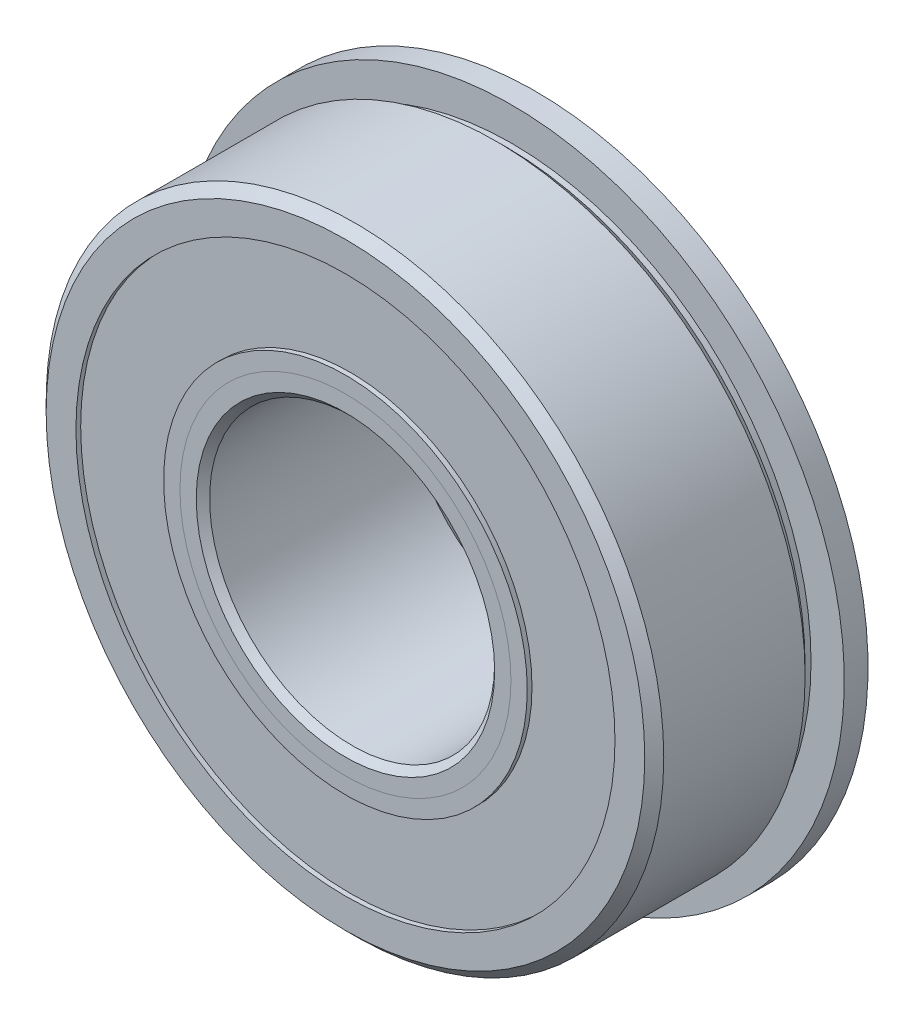
ISO-10303-21;
HEADER;
FILE_DESCRIPTION(('STEP AP214'),'2;1');
FILE_NAME('part.step','',(''),(''),'','','');
FILE_SCHEMA(('AUTOMOTIVE_DESIGN { 1 0 10303 214 1 1 1 1 }'));
ENDSEC;
DATA;
#1=APPLICATION_CONTEXT('core data for automotive mechanical design processes');
#2=APPLICATION_PROTOCOL_DEFINITION('international standard','automotive_design',2000,#1);
#3=PRODUCT_CONTEXT('',#1,'mechanical');
#4=PRODUCT('Part','Part','',(#3));
#5=PRODUCT_RELATED_PRODUCT_CATEGORY('part','',(#4));
#6=PRODUCT_DEFINITION_FORMATION('','',#4);
#7=PRODUCT_DEFINITION_CONTEXT('part definition',#1,'design');
#8=PRODUCT_DEFINITION('design','',#6,#7);
#9=PRODUCT_DEFINITION_SHAPE('','',#8);
#10=(LENGTH_UNIT() NAMED_UNIT(*) SI_UNIT(.MILLI.,.METRE.));
#11=(NAMED_UNIT(*) PLANE_ANGLE_UNIT() SI_UNIT($,.RADIAN.));
#12=(NAMED_UNIT(*) SI_UNIT($,.STERADIAN.) SOLID_ANGLE_UNIT());
#13=UNCERTAINTY_MEASURE_WITH_UNIT(LENGTH_MEASURE(1.E-05),#10,'distance_accuracy_value','');
#14=(GEOMETRIC_REPRESENTATION_CONTEXT(3) GLOBAL_UNCERTAINTY_ASSIGNED_CONTEXT((#13)) GLOBAL_UNIT_ASSIGNED_CONTEXT((#10,
#11,#12)) REPRESENTATION_CONTEXT('',''));
#15=CARTESIAN_POINT('',(0.,0.,0.));
#16=DIRECTION('',(0.,0.,1.));
#17=DIRECTION('',(1.,0.,0.));
#18=AXIS2_PLACEMENT_3D('',#15,#16,#17);
#19=CARTESIAN_POINT('',(0.,0.,6.35));
#20=DIRECTION('',(0.,0.,1.));
#21=DIRECTION('',(1.,0.,0.));
#22=AXIS2_PLACEMENT_3D('',#19,#20,#21);
#23=CYLINDRICAL_SURFACE('',#22,11.5062);
#24=CARTESIAN_POINT('',(0.,0.,-4.66432619959931));
#25=DIRECTION('',(0.,0.,1.));
#26=DIRECTION('',(1.,0.,0.));
#27=AXIS2_PLACEMENT_3D('',#24,#25,#26);
#28=CIRCLE('',#27,11.5062);
#29=CARTESIAN_POINT('',(11.5062,0.,-4.66432619959931));
#30=VERTEX_POINT('',#29);
#31=EDGE_CURVE('E11',#30,#30,#28,.T.);
#32=ORIENTED_EDGE('',*,*,#31,.T.);
#33=EDGE_LOOP('',(#32));
#34=FACE_BOUND('',#33,.T.);
#35=CARTESIAN_POINT('',(0.,0.,-5.7785));
#36=DIRECTION('',(0.,0.,-1.));
#37=DIRECTION('',(-1.,0.,0.));
#38=AXIS2_PLACEMENT_3D('',#35,#36,#37);
#39=CIRCLE('',#38,11.5062);
#40=CARTESIAN_POINT('',(-11.5062,0.,-5.7785));
#41=VERTEX_POINT('',#40);
#42=EDGE_CURVE('E68',#41,#41,#39,.T.);
#43=ORIENTED_EDGE('',*,*,#42,.T.);
#44=EDGE_LOOP('',(#43));
#45=FACE_BOUND('',#44,.T.);
#46=ADVANCED_FACE('F47',(#34,#45),#23,.F.);
#47=CARTESIAN_POINT('',(0.,18.0120192307692,-6.0325));
#48=DIRECTION('',(0.,0.,1.));
#49=DIRECTION('',(1.,0.,0.));
#50=AXIS2_PLACEMENT_3D('',#47,#48,#49);
#51=PLANE('',#50);
#52=CARTESIAN_POINT('',(0.,0.,-6.0325));
#53=DIRECTION('',(0.,0.,-1.));
#54=DIRECTION('',(-1.,0.,0.));
#55=AXIS2_PLACEMENT_3D('',#52,#53,#54);
#56=CIRCLE('',#55,12.426696);
#57=CARTESIAN_POINT('',(-12.426696,0.,-6.0325));
#58=VERTEX_POINT('',#57);
#59=EDGE_CURVE('E65',#58,#58,#56,.T.);
#60=ORIENTED_EDGE('',*,*,#59,.F.);
#61=EDGE_LOOP('',(#60));
#62=FACE_BOUND('',#61,.T.);
#63=CARTESIAN_POINT('',(0.,0.,-6.0325));
#64=DIRECTION('',(0.,0.,1.));
#65=DIRECTION('',(1.,0.,0.));
#66=AXIS2_PLACEMENT_3D('',#63,#64,#65);
#67=CIRCLE('',#66,18.0120192307692);
#68=CARTESIAN_POINT('',(18.0120192307692,0.,-6.0325));
#69=VERTEX_POINT('',#68);
#70=EDGE_CURVE('E58',#69,#69,#67,.T.);
#71=ORIENTED_EDGE('',*,*,#70,.F.);
#72=EDGE_LOOP('',(#71));
#73=FACE_BOUND('',#72,.T.);
#74=ADVANCED_FACE('F49',(#62,#73),#51,.F.);
#75=CARTESIAN_POINT('',(0.,18.0120192307692,-4.66432619959931));
#76=DIRECTION('',(0.,0.,-1.));
#77=DIRECTION('',(-1.,0.,0.));
#78=AXIS2_PLACEMENT_3D('',#75,#76,#77);
#79=PLANE('',#78);
#80=ORIENTED_EDGE('',*,*,#31,.F.);
#81=EDGE_LOOP('',(#80));
#82=FACE_BOUND('',#81,.T.);
#83=CARTESIAN_POINT('',(0.,0.,-4.66432619959931));
#84=DIRECTION('',(0.,0.,1.));
#85=DIRECTION('',(1.,0.,0.));
#86=AXIS2_PLACEMENT_3D('',#83,#84,#85);
#87=CIRCLE('',#86,18.0120192307692);
#88=CARTESIAN_POINT('',(18.0120192307692,0.,-4.66432619959931));
#89=VERTEX_POINT('',#88);
#90=EDGE_CURVE('E54',#89,#89,#87,.T.);
#91=ORIENTED_EDGE('',*,*,#90,.T.);
#92=EDGE_LOOP('',(#91));
#93=FACE_BOUND('',#92,.T.);
#94=ADVANCED_FACE('F90',(#82,#93),#79,.F.);
#95=CARTESIAN_POINT('',(0.,0.,6.35));
#96=DIRECTION('',(0.,0.,1.));
#97=DIRECTION('',(1.,0.,0.));
#98=AXIS2_PLACEMENT_3D('',#95,#96,#97);
#99=CYLINDRICAL_SURFACE('',#98,18.0120192307692);
#100=ORIENTED_EDGE('',*,*,#90,.F.);
#101=EDGE_LOOP('',(#100));
#102=FACE_BOUND('',#101,.T.);
#103=ORIENTED_EDGE('',*,*,#70,.T.);
#104=EDGE_LOOP('',(#103));
#105=FACE_BOUND('',#104,.T.);
#106=ADVANCED_FACE('F84',(#102,#105),#99,.T.);
#107=CARTESIAN_POINT('',(0.,0.,-5.7785));
#108=DIRECTION('',(0.,0.,-1.));
#109=DIRECTION('',(-1.,0.,0.));
#110=AXIS2_PLACEMENT_3D('',#107,#108,#109);
#111=CYLINDRICAL_SURFACE('',#110,12.426696);
#112=CARTESIAN_POINT('',(0.,0.,-5.7785));
#113=DIRECTION('',(0.,0.,-1.));
#114=DIRECTION('',(-1.,0.,0.));
#115=AXIS2_PLACEMENT_3D('',#112,#113,#114);
#116=CIRCLE('',#115,12.426696);
#117=CARTESIAN_POINT('',(-12.426696,0.,-5.7785));
#118=VERTEX_POINT('',#117);
#119=EDGE_CURVE('E62',#118,#118,#116,.T.);
#120=ORIENTED_EDGE('',*,*,#119,.F.);
#121=EDGE_LOOP('',(#120));
#122=FACE_BOUND('',#121,.T.);
#123=ORIENTED_EDGE('',*,*,#59,.T.);
#124=EDGE_LOOP('',(#123));
#125=FACE_BOUND('',#124,.T.);
#126=ADVANCED_FACE('F78',(#122,#125),#111,.F.);
#127=CARTESIAN_POINT('',(0.,0.,-5.7785));
#128=DIRECTION('',(0.,0.,-1.));
#129=DIRECTION('',(-1.,0.,0.));
#130=AXIS2_PLACEMENT_3D('',#127,#128,#129);
#131=PLANE('',#130);
#132=ORIENTED_EDGE('',*,*,#42,.F.);
#133=EDGE_LOOP('',(#132));
#134=FACE_BOUND('',#133,.T.);
#135=ORIENTED_EDGE('',*,*,#119,.T.);
#136=EDGE_LOOP('',(#135));
#137=FACE_BOUND('',#136,.T.);
#138=ADVANCED_FACE('F75',(#134,#137),#131,.T.);
#139=CLOSED_SHELL('',(#46,#74,#94,#106,#126,#138));
#140=MANIFOLD_SOLID_BREP('B2',#139);
#141=CARTESIAN_POINT('',(0.,18.0120192307692,6.0325));
#142=DIRECTION('',(0.,0.,-1.));
#143=DIRECTION('',(-1.,0.,0.));
#144=AXIS2_PLACEMENT_3D('',#141,#142,#143);
#145=PLANE('',#144);
#146=CARTESIAN_POINT('',(0.,0.,6.0325));
#147=DIRECTION('',(0.,0.,1.));
#148=DIRECTION('',(1.,0.,0.));
#149=AXIS2_PLACEMENT_3D('',#146,#147,#148);
#150=CIRCLE('',#149,12.1504807692308);
#151=CARTESIAN_POINT('',(12.1504807692308,0.,6.0325));
#152=VERTEX_POINT('',#151);
#153=EDGE_CURVE('E46',#152,#152,#150,.T.);
#154=ORIENTED_EDGE('',*,*,#153,.F.);
#155=EDGE_LOOP('',(#154));
#156=FACE_BOUND('',#155,.T.);
#157=CARTESIAN_POINT('',(0.,0.,6.0325));
#158=DIRECTION('',(0.,0.,1.));
#159=DIRECTION('',(1.,0.,0.));
#160=AXIS2_PLACEMENT_3D('',#157,#158,#159);
#161=CIRCLE('',#160,18.0120192307692);
#162=CARTESIAN_POINT('',(18.0120192307692,0.,6.0325));
#163=VERTEX_POINT('',#162);
#164=EDGE_CURVE('E175',#163,#163,#161,.T.);
#165=ORIENTED_EDGE('',*,*,#164,.T.);
#166=EDGE_LOOP('',(#165));
#167=FACE_BOUND('',#166,.T.);
#168=ADVANCED_FACE('F161',(#156,#167),#145,.F.);
#169=CARTESIAN_POINT('',(0.,0.,6.35));
#170=DIRECTION('',(0.,0.,1.));
#171=DIRECTION('',(1.,0.,0.));
#172=AXIS2_PLACEMENT_3D('',#169,#170,#171);
#173=CYLINDRICAL_SURFACE('',#172,12.1504807692308);
#174=CARTESIAN_POINT('',(0.,0.,4.66432619959931));
#175=DIRECTION('',(0.,0.,1.));
#176=DIRECTION('',(1.,0.,0.));
#177=AXIS2_PLACEMENT_3D('',#174,#175,#176);
#178=CIRCLE('',#177,12.1504807692308);
#179=CARTESIAN_POINT('',(12.1504807692308,0.,4.66432619959931));
#180=VERTEX_POINT('',#179);
#181=EDGE_CURVE('E167',#180,#180,#178,.T.);
#182=ORIENTED_EDGE('',*,*,#181,.F.);
#183=EDGE_LOOP('',(#182));
#184=FACE_BOUND('',#183,.T.);
#185=ORIENTED_EDGE('',*,*,#153,.T.);
#186=EDGE_LOOP('',(#185));
#187=FACE_BOUND('',#186,.T.);
#188=ADVANCED_FACE('F190',(#184,#187),#173,.F.);
#189=CARTESIAN_POINT('',(0.,18.0120192307692,4.66432619959931));
#190=DIRECTION('',(0.,0.,1.));
#191=DIRECTION('',(1.,0.,0.));
#192=AXIS2_PLACEMENT_3D('',#189,#190,#191);
#193=PLANE('',#192);
#194=CARTESIAN_POINT('',(0.,0.,4.66432619959931));
#195=DIRECTION('',(0.,0.,1.));
#196=DIRECTION('',(1.,0.,0.));
#197=AXIS2_PLACEMENT_3D('',#194,#195,#196);
#198=CIRCLE('',#197,18.0120192307692);
#199=CARTESIAN_POINT('',(18.0120192307692,0.,4.66432619959931));
#200=VERTEX_POINT('',#199);
#201=EDGE_CURVE('E171',#200,#200,#198,.T.);
#202=ORIENTED_EDGE('',*,*,#201,.F.);
#203=EDGE_LOOP('',(#202));
#204=FACE_BOUND('',#203,.T.);
#205=ORIENTED_EDGE('',*,*,#181,.T.);
#206=EDGE_LOOP('',(#205));
#207=FACE_BOUND('',#206,.T.);
#208=ADVANCED_FACE('F185',(#204,#207),#193,.F.);
#209=CARTESIAN_POINT('',(0.,0.,6.35));
#210=DIRECTION('',(0.,0.,1.));
#211=DIRECTION('',(1.,0.,0.));
#212=AXIS2_PLACEMENT_3D('',#209,#210,#211);
#213=CYLINDRICAL_SURFACE('',#212,18.0120192307692);
#214=ORIENTED_EDGE('',*,*,#164,.F.);
#215=EDGE_LOOP('',(#214));
#216=FACE_BOUND('',#215,.T.);
#217=ORIENTED_EDGE('',*,*,#201,.T.);
#218=EDGE_LOOP('',(#217));
#219=FACE_BOUND('',#218,.T.);
#220=ADVANCED_FACE('F182',(#216,#219),#213,.T.);
#221=CLOSED_SHELL('',(#168,#188,#208,#220));
#222=MANIFOLD_SOLID_BREP('B6',#221);
#223=CARTESIAN_POINT('',(-6.5435091405665,13.5877367390534,0.));
#224=DIRECTION('',(0.,0.,1.));
#225=DIRECTION('',(-0.433883739117546,0.900968867902425,0.));
#226=AXIS2_PLACEMENT_3D('',#223,#224,#225);
#227=SPHERICAL_SURFACE('',#226,4.66432619959931);
#228=CARTESIAN_POINT('',(-6.5435091405665,13.5877367390534,4.66432619959931));
#229=VERTEX_POINT('',#228);
#230=VERTEX_LOOP('',#229);
#231=FACE_BOUND('',#230,.T.);
#232=ADVANCED_FACE('F228',(#231),#227,.T.);
#233=CLOSED_SHELL('',(#232));
#234=MANIFOLD_SOLID_BREP('B41',#233);
#235=CARTESIAN_POINT('',(-11.7909960449709,9.40300557428217,0.));
#236=DIRECTION('',(0.,0.,1.));
#237=DIRECTION('',(-0.781831482468022,0.623489801858743,0.));
#238=AXIS2_PLACEMENT_3D('',#235,#236,#237);
#239=SPHERICAL_SURFACE('',#238,4.66432619959931);
#240=CARTESIAN_POINT('',(-11.7909960449709,9.40300557428217,4.66432619959931));
#241=VERTEX_POINT('',#240);
#242=VERTEX_LOOP('',#241);
#243=FACE_BOUND('',#242,.T.);
#244=ADVANCED_FACE('F246',(#243),#239,.T.);
#245=CLOSED_SHELL('',(#244));
#246=MANIFOLD_SOLID_BREP('B157',#245);
#247=CARTESIAN_POINT('',(-14.7031315755921,3.35589383522882,0.));
#248=DIRECTION('',(0.,0.,1.));
#249=DIRECTION('',(-0.974927912181821,0.222520933956325,0.));
#250=AXIS2_PLACEMENT_3D('',#247,#248,#249);
#251=SPHERICAL_SURFACE('',#250,4.66432619959931);
#252=CARTESIAN_POINT('',(-14.7031315755921,3.35589383522882,4.66432619959931));
#253=VERTEX_POINT('',#252);
#254=VERTEX_LOOP('',#253);
#255=FACE_BOUND('',#254,.T.);
#256=ADVANCED_FACE('F264',(#255),#251,.T.);
#257=CLOSED_SHELL('',(#256));
#258=MANIFOLD_SOLID_BREP('B224',#257);
#259=CARTESIAN_POINT('',(-14.7031315755922,-3.35589383522853,0.));
#260=DIRECTION('',(0.,0.,1.));
#261=DIRECTION('',(-0.974927912181826,-0.222520933956305,0.));
#262=AXIS2_PLACEMENT_3D('',#259,#260,#261);
#263=SPHERICAL_SURFACE('',#262,4.66432619959931);
#264=CARTESIAN_POINT('',(-14.7031315755922,-3.35589383522853,4.66432619959931));
#265=VERTEX_POINT('',#264);
#266=VERTEX_LOOP('',#265);
#267=FACE_BOUND('',#266,.T.);
#268=ADVANCED_FACE('F282',(#267),#263,.T.);
#269=CLOSED_SHELL('',(#268));
#270=MANIFOLD_SOLID_BREP('B242',#269);
#271=CARTESIAN_POINT('',(-11.7909960449711,-9.40300557428192,0.));
#272=DIRECTION('',(0.,0.,1.));
#273=DIRECTION('',(-0.781831482468035,-0.623489801858727,0.));
#274=AXIS2_PLACEMENT_3D('',#271,#272,#273);
#275=SPHERICAL_SURFACE('',#274,4.66432619959931);
#276=CARTESIAN_POINT('',(-11.7909960449711,-9.40300557428192,4.66432619959931));
#277=VERTEX_POINT('',#276);
#278=VERTEX_LOOP('',#277);
#279=FACE_BOUND('',#278,.T.);
#280=ADVANCED_FACE('F300',(#279),#275,.T.);
#281=CLOSED_SHELL('',(#280));
#282=MANIFOLD_SOLID_BREP('B260',#281);
#283=CARTESIAN_POINT('',(-6.54350914056678,-13.5877367390533,0.));
#284=DIRECTION('',(0.,0.,1.));
#285=DIRECTION('',(-0.433883739117565,-0.900968867902416,0.));
#286=AXIS2_PLACEMENT_3D('',#283,#284,#285);
#287=SPHERICAL_SURFACE('',#286,4.66432619959931);
#288=CARTESIAN_POINT('',(-6.54350914056678,-13.5877367390533,4.66432619959931));
#289=VERTEX_POINT('',#288);
#290=VERTEX_LOOP('',#289);
#291=FACE_BOUND('',#290,.T.);
#292=ADVANCED_FACE('F318',(#291),#287,.T.);
#293=CLOSED_SHELL('',(#292));
#294=MANIFOLD_SOLID_BREP('B278',#293);
#295=CARTESIAN_POINT('',(0.,-15.08125,0.));
#296=DIRECTION('',(0.,0.,1.));
#297=DIRECTION('',(0.,-1.,0.));
#298=AXIS2_PLACEMENT_3D('',#295,#296,#297);
#299=SPHERICAL_SURFACE('',#298,4.66432619959931);
#300=CARTESIAN_POINT('',(0.,-15.08125,4.66432619959931));
#301=VERTEX_POINT('',#300);
#302=VERTEX_LOOP('',#301);
#303=FACE_BOUND('',#302,.T.);
#304=ADVANCED_FACE('F336',(#303),#299,.T.);
#305=CLOSED_SHELL('',(#304));
#306=MANIFOLD_SOLID_BREP('B296',#305);
#307=CARTESIAN_POINT('',(6.54350914056659,-13.5877367390534,0.));
#308=DIRECTION('',(0.,0.,1.));
#309=DIRECTION('',(0.433883739117553,-0.900968867902422,0.));
#310=AXIS2_PLACEMENT_3D('',#307,#308,#309);
#311=SPHERICAL_SURFACE('',#310,4.66432619959931);
#312=CARTESIAN_POINT('',(6.54350914056659,-13.5877367390534,4.66432619959931));
#313=VERTEX_POINT('',#312);
#314=VERTEX_LOOP('',#313);
#315=FACE_BOUND('',#314,.T.);
#316=ADVANCED_FACE('F354',(#315),#311,.T.);
#317=CLOSED_SHELL('',(#316));
#318=MANIFOLD_SOLID_BREP('B314',#317);
#319=CARTESIAN_POINT('',(11.7909960449709,-9.40300557428208,0.));
#320=DIRECTION('',(0.,0.,1.));
#321=DIRECTION('',(0.781831482468027,-0.623489801858737,0.));
#322=AXIS2_PLACEMENT_3D('',#319,#320,#321);
#323=SPHERICAL_SURFACE('',#322,4.66432619959931);
#324=CARTESIAN_POINT('',(11.7909960449709,-9.40300557428208,4.66432619959931));
#325=VERTEX_POINT('',#324);
#326=VERTEX_LOOP('',#325);
#327=FACE_BOUND('',#326,.T.);
#328=ADVANCED_FACE('F372',(#327),#323,.T.);
#329=CLOSED_SHELL('',(#328));
#330=MANIFOLD_SOLID_BREP('B332',#329);
#331=CARTESIAN_POINT('',(14.7031315755921,-3.35589383522872,0.));
#332=DIRECTION('',(0.,0.,1.));
#333=DIRECTION('',(0.974927912181823,-0.222520933956318,0.));
#334=AXIS2_PLACEMENT_3D('',#331,#332,#333);
#335=SPHERICAL_SURFACE('',#334,4.66432619959931);
#336=CARTESIAN_POINT('',(14.7031315755921,-3.35589383522872,4.66432619959931));
#337=VERTEX_POINT('',#336);
#338=VERTEX_LOOP('',#337);
#339=FACE_BOUND('',#338,.T.);
#340=ADVANCED_FACE('F390',(#339),#335,.T.);
#341=CLOSED_SHELL('',(#340));
#342=MANIFOLD_SOLID_BREP('B350',#341);
#343=CARTESIAN_POINT('',(14.7031315755921,3.35589383522862,0.));
#344=DIRECTION('',(0.,0.,1.));
#345=DIRECTION('',(0.974927912181824,0.222520933956311,0.));
#346=AXIS2_PLACEMENT_3D('',#343,#344,#345);
#347=SPHERICAL_SURFACE('',#346,4.66432619959931);
#348=CARTESIAN_POINT('',(14.7031315755921,3.35589383522862,4.66432619959931));
#349=VERTEX_POINT('',#348);
#350=VERTEX_LOOP('',#349);
#351=FACE_BOUND('',#350,.T.);
#352=ADVANCED_FACE('F408',(#351),#347,.T.);
#353=CLOSED_SHELL('',(#352));
#354=MANIFOLD_SOLID_BREP('B368',#353);
#355=CARTESIAN_POINT('',(11.790996044971,9.403005574282,0.));
#356=DIRECTION('',(0.,0.,1.));
#357=DIRECTION('',(0.781831482468031,0.623489801858732,0.));
#358=AXIS2_PLACEMENT_3D('',#355,#356,#357);
#359=SPHERICAL_SURFACE('',#358,4.66432619959931);
#360=CARTESIAN_POINT('',(11.790996044971,9.403005574282,4.66432619959931));
#361=VERTEX_POINT('',#360);
#362=VERTEX_LOOP('',#361);
#363=FACE_BOUND('',#362,.T.);
#364=ADVANCED_FACE('F426',(#363),#359,.T.);
#365=CLOSED_SHELL('',(#364));
#366=MANIFOLD_SOLID_BREP('B386',#365);
#367=CARTESIAN_POINT('',(6.54350914056669,13.5877367390534,0.));
#368=DIRECTION('',(0.,0.,1.));
#369=DIRECTION('',(0.433883739117559,0.900968867902419,0.));
#370=AXIS2_PLACEMENT_3D('',#367,#368,#369);
#371=SPHERICAL_SURFACE('',#370,4.66432619959931);
#372=CARTESIAN_POINT('',(6.54350914056669,13.5877367390534,4.66432619959931));
#373=VERTEX_POINT('',#372);
#374=VERTEX_LOOP('',#373);
#375=FACE_BOUND('',#374,.T.);
#376=ADVANCED_FACE('F444',(#375),#371,.T.);
#377=CLOSED_SHELL('',(#376));
#378=MANIFOLD_SOLID_BREP('B404',#377);
#379=CARTESIAN_POINT('',(0.,15.08125,0.));
#380=DIRECTION('',(0.,0.,1.));
#381=DIRECTION('',(0.,1.,0.));
#382=AXIS2_PLACEMENT_3D('',#379,#380,#381);
#383=SPHERICAL_SURFACE('',#382,4.66432619959931);
#384=CARTESIAN_POINT('',(0.,15.08125,4.66432619959931));
#385=VERTEX_POINT('',#384);
#386=VERTEX_LOOP('',#385);
#387=FACE_BOUND('',#386,.T.);
#388=ADVANCED_FACE('F464',(#387),#383,.T.);
#389=CLOSED_SHELL('',(#388));
#390=MANIFOLD_SOLID_BREP('B422',#389);
#391=CARTESIAN_POINT('',(0.,10.16,-7.9248));
#392=DIRECTION('',(0.,0.,1.));
#393=DIRECTION('',(1.,0.,0.));
#394=AXIS2_PLACEMENT_3D('',#391,#392,#393);
#395=PLANE('',#394);
#396=CARTESIAN_POINT('',(0.,0.,-7.9248));
#397=DIRECTION('',(0.,0.,1.));
#398=DIRECTION('',(1.,0.,0.));
#399=AXIS2_PLACEMENT_3D('',#396,#397,#398);
#400=CIRCLE('',#399,10.16);
#401=CARTESIAN_POINT('',(10.16,0.,-7.9248));
#402=VERTEX_POINT('',#401);
#403=EDGE_CURVE('E510',#402,#402,#400,.T.);
#404=ORIENTED_EDGE('',*,*,#403,.T.);
#405=EDGE_LOOP('',(#404));
#406=FACE_BOUND('',#405,.T.);
#407=CARTESIAN_POINT('',(0.,0.,-7.9248));
#408=DIRECTION('',(0.,0.,-1.));
#409=DIRECTION('',(-1.,0.,0.));
#410=AXIS2_PLACEMENT_3D('',#407,#408,#409);
#411=CIRCLE('',#410,10.602976);
#412=CARTESIAN_POINT('',(-10.602976,0.,-7.9248));
#413=VERTEX_POINT('',#412);
#414=EDGE_CURVE('E529',#413,#413,#411,.T.);
#415=ORIENTED_EDGE('',*,*,#414,.T.);
#416=EDGE_LOOP('',(#415));
#417=FACE_BOUND('',#416,.T.);
#418=ADVANCED_FACE('F484',(#406,#417),#395,.F.);
#419=CARTESIAN_POINT('',(0.,11.0607213347156,6.35));
#420=DIRECTION('',(0.,0.,-1.));
#421=DIRECTION('',(-1.,0.,0.));
#422=AXIS2_PLACEMENT_3D('',#419,#420,#421);
#423=PLANE('',#422);
#424=CARTESIAN_POINT('',(0.,0.,6.35));
#425=DIRECTION('',(0.,0.,1.));
#426=DIRECTION('',(1.,0.,0.));
#427=AXIS2_PLACEMENT_3D('',#424,#425,#426);
#428=CIRCLE('',#427,9.97096190020035);
#429=CARTESIAN_POINT('',(9.97096190020035,0.,6.35));
#430=VERTEX_POINT('',#429);
#431=EDGE_CURVE('E519',#430,#430,#428,.T.);
#432=ORIENTED_EDGE('',*,*,#431,.F.);
#433=EDGE_LOOP('',(#432));
#434=FACE_BOUND('',#433,.T.);
#435=CARTESIAN_POINT('',(0.,0.,6.35));
#436=DIRECTION('',(0.,0.,1.));
#437=DIRECTION('',(1.,0.,0.));
#438=AXIS2_PLACEMENT_3D('',#435,#436,#437);
#439=CIRCLE('',#438,11.0607213347156);
#440=CARTESIAN_POINT('',(11.0607213347156,0.,6.35));
#441=VERTEX_POINT('',#440);
#442=EDGE_CURVE('E463',#441,#441,#439,.T.);
#443=ORIENTED_EDGE('',*,*,#442,.T.);
#444=EDGE_LOOP('',(#443));
#445=FACE_BOUND('',#444,.T.);
#446=ADVANCED_FACE('F486',(#434,#445),#423,.F.);
#447=CARTESIAN_POINT('',(0.,0.,5.26024056548479));
#448=DIRECTION('',(0.,0.,1.));
#449=DIRECTION('',(1.,0.,0.));
#450=AXIS2_PLACEMENT_3D('',#447,#448,#449);
#451=CONICAL_SURFACE('',#450,9.97096190020035,0.78539816339745);
#452=ORIENTED_EDGE('',*,*,#442,.F.);
#453=EDGE_LOOP('',(#452));
#454=FACE_BOUND('',#453,.T.);
#455=CARTESIAN_POINT('',(0.,0.,5.26024056548479));
#456=DIRECTION('',(0.,0.,1.));
#457=DIRECTION('',(1.,0.,0.));
#458=AXIS2_PLACEMENT_3D('',#455,#456,#457);
#459=CIRCLE('',#458,9.97096190020035);
#460=CARTESIAN_POINT('',(9.97096190020035,0.,5.26024056548479));
#461=VERTEX_POINT('',#460);
#462=EDGE_CURVE('E491',#461,#461,#459,.T.);
#463=ORIENTED_EDGE('',*,*,#462,.T.);
#464=EDGE_LOOP('',(#463));
#465=FACE_BOUND('',#464,.T.);
#466=ADVANCED_FACE('F575',(#454,#465),#451,.T.);
#467=CARTESIAN_POINT('',(0.,0.,6.35));
#468=DIRECTION('',(0.,0.,1.));
#469=DIRECTION('',(1.,0.,0.));
#470=AXIS2_PLACEMENT_3D('',#467,#468,#469);
#471=CYLINDRICAL_SURFACE('',#470,9.97096190020035);
#472=ORIENTED_EDGE('',*,*,#462,.F.);
#473=EDGE_LOOP('',(#472));
#474=FACE_BOUND('',#473,.T.);
#475=CARTESIAN_POINT('',(0.,0.,0.));
#476=DIRECTION('',(0.,0.,1.));
#477=DIRECTION('',(1.,0.,0.));
#478=AXIS2_PLACEMENT_3D('',#475,#476,#477);
#479=CIRCLE('',#478,9.97096190020035);
#480=CARTESIAN_POINT('',(9.97096190020035,0.,0.));
#481=VERTEX_POINT('',#480);
#482=EDGE_CURVE('E495',#481,#481,#479,.T.);
#483=ORIENTED_EDGE('',*,*,#482,.T.);
#484=EDGE_LOOP('',(#483));
#485=FACE_BOUND('',#484,.T.);
#486=ADVANCED_FACE('F651',(#474,#485),#471,.T.);
#487=CARTESIAN_POINT('',(0.,9.97096190020035,0.));
#488=DIRECTION('',(0.,0.,-1.));
#489=DIRECTION('',(-1.,0.,0.));
#490=AXIS2_PLACEMENT_3D('',#487,#488,#489);
#491=PLANE('',#490);
#492=ORIENTED_EDGE('',*,*,#482,.F.);
#493=EDGE_LOOP('',(#492));
#494=FACE_BOUND('',#493,.T.);
#495=CARTESIAN_POINT('',(0.,0.,0.));
#496=DIRECTION('',(0.,0.,1.));
#497=DIRECTION('',(1.,0.,0.));
#498=AXIS2_PLACEMENT_3D('',#495,#496,#497);
#499=CIRCLE('',#498,10.4169238004007);
#500=CARTESIAN_POINT('',(10.4169238004007,0.,0.));
#501=VERTEX_POINT('',#500);
#502=EDGE_CURVE('E499',#501,#501,#499,.T.);
#503=ORIENTED_EDGE('',*,*,#502,.T.);
#504=EDGE_LOOP('',(#503));
#505=FACE_BOUND('',#504,.T.);
#506=ADVANCED_FACE('F566',(#494,#505),#491,.F.);
#507=CARTESIAN_POINT('',(0.,0.,0.));
#508=DIRECTION('',(0.,0.,1.));
#509=DIRECTION('',(1.,0.,0.));
#510=AXIS2_PLACEMENT_3D('',#507,#508,#509);
#511=TOROIDAL_SURFACE('',#510,15.08125,4.66432619959931);
#512=ORIENTED_EDGE('',*,*,#502,.F.);
#513=EDGE_LOOP('',(#512));
#514=FACE_BOUND('',#513,.T.);
#515=CARTESIAN_POINT('',(0.,0.,-2.99582315795986));
#516=DIRECTION('',(0.,0.,1.));
#517=DIRECTION('',(1.,0.,0.));
#518=AXIS2_PLACEMENT_3D('',#515,#516,#517);
#519=CIRCLE('',#518,11.5062);
#520=CARTESIAN_POINT('',(11.5062,0.,-2.99582315795986));
#521=VERTEX_POINT('',#520);
#522=EDGE_CURVE('E504',#521,#521,#519,.T.);
#523=ORIENTED_EDGE('',*,*,#522,.T.);
#524=EDGE_LOOP('',(#523));
#525=FACE_BOUND('',#524,.T.);
#526=ADVANCED_FACE('F560',(#514,#525),#511,.F.);
#527=CARTESIAN_POINT('',(0.,0.,6.35));
#528=DIRECTION('',(0.,0.,1.));
#529=DIRECTION('',(1.,0.,0.));
#530=AXIS2_PLACEMENT_3D('',#527,#528,#529);
#531=CYLINDRICAL_SURFACE('',#530,11.5062);
#532=ORIENTED_EDGE('',*,*,#522,.F.);
#533=EDGE_LOOP('',(#532));
#534=FACE_BOUND('',#533,.T.);
#535=CARTESIAN_POINT('',(0.,0.,-7.9248));
#536=DIRECTION('',(0.,0.,1.));
#537=DIRECTION('',(1.,0.,0.));
#538=AXIS2_PLACEMENT_3D('',#535,#536,#537);
#539=CIRCLE('',#538,11.5062);
#540=CARTESIAN_POINT('',(11.5062,0.,-7.9248));
#541=VERTEX_POINT('',#540);
#542=EDGE_CURVE('E507',#541,#541,#539,.T.);
#543=ORIENTED_EDGE('',*,*,#542,.T.);
#544=EDGE_LOOP('',(#543));
#545=FACE_BOUND('',#544,.T.);
#546=ADVANCED_FACE('F555',(#534,#545),#531,.T.);
#547=CARTESIAN_POINT('',(0.,0.,-7.9248));
#548=DIRECTION('',(0.,0.,-1.));
#549=DIRECTION('',(-1.,0.,0.));
#550=AXIS2_PLACEMENT_3D('',#547,#548,#549);
#551=CIRCLE('',#550,11.063224);
#552=CARTESIAN_POINT('',(-11.063224,0.,-7.9248));
#553=VERTEX_POINT('',#552);
#554=EDGE_CURVE('E523',#553,#553,#551,.T.);
#555=ORIENTED_EDGE('',*,*,#554,.F.);
#556=EDGE_LOOP('',(#555));
#557=FACE_BOUND('',#556,.T.);
#558=ORIENTED_EDGE('',*,*,#542,.F.);
#559=EDGE_LOOP('',(#558));
#560=FACE_BOUND('',#559,.T.);
#561=ADVANCED_FACE('F551',(#557,#560),#395,.F.);
#562=CARTESIAN_POINT('',(0.,0.,-7.2898));
#563=DIRECTION('',(0.,0.,-1.));
#564=DIRECTION('',(-1.,0.,0.));
#565=AXIS2_PLACEMENT_3D('',#562,#563,#564);
#566=CONICAL_SURFACE('',#565,9.525,0.785398163397447);
#567=ORIENTED_EDGE('',*,*,#403,.F.);
#568=EDGE_LOOP('',(#567));
#569=FACE_BOUND('',#568,.T.);
#570=CARTESIAN_POINT('',(0.,0.,-7.2898));
#571=DIRECTION('',(0.,0.,1.));
#572=DIRECTION('',(1.,0.,0.));
#573=AXIS2_PLACEMENT_3D('',#570,#571,#572);
#574=CIRCLE('',#573,9.525);
#575=CARTESIAN_POINT('',(9.525,0.,-7.2898));
#576=VERTEX_POINT('',#575);
#577=EDGE_CURVE('E513',#576,#576,#574,.T.);
#578=ORIENTED_EDGE('',*,*,#577,.T.);
#579=EDGE_LOOP('',(#578));
#580=FACE_BOUND('',#579,.T.);
#581=ADVANCED_FACE('F554',(#569,#580),#566,.F.);
#582=CARTESIAN_POINT('',(0.,0.,6.35));
#583=DIRECTION('',(0.,0.,1.));
#584=DIRECTION('',(1.,0.,0.));
#585=AXIS2_PLACEMENT_3D('',#582,#583,#584);
#586=CYLINDRICAL_SURFACE('',#585,9.525);
#587=ORIENTED_EDGE('',*,*,#577,.F.);
#588=EDGE_LOOP('',(#587));
#589=FACE_BOUND('',#588,.T.);
#590=CARTESIAN_POINT('',(0.,0.,5.90403809979966));
#591=DIRECTION('',(0.,0.,1.));
#592=DIRECTION('',(1.,0.,0.));
#593=AXIS2_PLACEMENT_3D('',#590,#591,#592);
#594=CIRCLE('',#593,9.525);
#595=CARTESIAN_POINT('',(9.525,0.,5.90403809979966));
#596=VERTEX_POINT('',#595);
#597=EDGE_CURVE('E516',#596,#596,#594,.T.);
#598=ORIENTED_EDGE('',*,*,#597,.T.);
#599=EDGE_LOOP('',(#598));
#600=FACE_BOUND('',#599,.T.);
#601=ADVANCED_FACE('F581',(#589,#600),#586,.F.);
#602=CARTESIAN_POINT('',(0.,0.,6.35));
#603=DIRECTION('',(0.,0.,1.));
#604=DIRECTION('',(1.,0.,0.));
#605=AXIS2_PLACEMENT_3D('',#602,#603,#604);
#606=CONICAL_SURFACE('',#605,9.97096190020035,0.78539816339745);
#607=ORIENTED_EDGE('',*,*,#597,.F.);
#608=EDGE_LOOP('',(#607));
#609=FACE_BOUND('',#608,.T.);
#610=ORIENTED_EDGE('',*,*,#431,.T.);
#611=EDGE_LOOP('',(#610));
#612=FACE_BOUND('',#611,.T.);
#613=ADVANCED_FACE('F547',(#609,#612),#606,.F.);
#614=CARTESIAN_POINT('',(0.,0.,-7.7978));
#615=DIRECTION('',(0.,0.,-1.));
#616=DIRECTION('',(-1.,0.,0.));
#617=AXIS2_PLACEMENT_3D('',#614,#615,#616);
#618=CYLINDRICAL_SURFACE('',#617,11.063224);
#619=CARTESIAN_POINT('',(0.,0.,-7.7978));
#620=DIRECTION('',(0.,0.,-1.));
#621=DIRECTION('',(-1.,0.,0.));
#622=AXIS2_PLACEMENT_3D('',#619,#620,#621);
#623=CIRCLE('',#622,11.063224);
#624=CARTESIAN_POINT('',(-11.063224,0.,-7.7978));
#625=VERTEX_POINT('',#624);
#626=EDGE_CURVE('E522',#625,#625,#623,.T.);
#627=ORIENTED_EDGE('',*,*,#626,.F.);
#628=EDGE_LOOP('',(#627));
#629=FACE_BOUND('',#628,.T.);
#630=ORIENTED_EDGE('',*,*,#554,.T.);
#631=EDGE_LOOP('',(#630));
#632=FACE_BOUND('',#631,.T.);
#633=ADVANCED_FACE('F541',(#629,#632),#618,.F.);
#634=CARTESIAN_POINT('',(0.,0.,-7.7978));
#635=DIRECTION('',(0.,0.,-1.));
#636=DIRECTION('',(-1.,0.,0.));
#637=AXIS2_PLACEMENT_3D('',#634,#635,#636);
#638=PLANE('',#637);
#639=CARTESIAN_POINT('',(0.,0.,-7.7978));
#640=DIRECTION('',(0.,0.,-1.));
#641=DIRECTION('',(-1.,0.,0.));
#642=AXIS2_PLACEMENT_3D('',#639,#640,#641);
#643=CIRCLE('',#642,10.602976);
#644=CARTESIAN_POINT('',(-10.602976,0.,-7.7978));
#645=VERTEX_POINT('',#644);
#646=EDGE_CURVE('E526',#645,#645,#643,.T.);
#647=ORIENTED_EDGE('',*,*,#646,.F.);
#648=EDGE_LOOP('',(#647));
#649=FACE_BOUND('',#648,.T.);
#650=ORIENTED_EDGE('',*,*,#626,.T.);
#651=EDGE_LOOP('',(#650));
#652=FACE_BOUND('',#651,.T.);
#653=ADVANCED_FACE('F538',(#649,#652),#638,.T.);
#654=CARTESIAN_POINT('',(0.,0.,-7.7978));
#655=DIRECTION('',(0.,0.,-1.));
#656=DIRECTION('',(-1.,0.,0.));
#657=AXIS2_PLACEMENT_3D('',#654,#655,#656);
#658=CYLINDRICAL_SURFACE('',#657,10.602976);
#659=ORIENTED_EDGE('',*,*,#646,.T.);
#660=EDGE_LOOP('',(#659));
#661=FACE_BOUND('',#660,.T.);
#662=ORIENTED_EDGE('',*,*,#414,.F.);
#663=EDGE_LOOP('',(#662));
#664=FACE_BOUND('',#663,.T.);
#665=ADVANCED_FACE('F535',(#661,#664),#658,.T.);
#666=CLOSED_SHELL('',(#418,#446,#466,#486,#506,#526,#546,#561,#581,#601,#613,#633,#653,#665));
#667=MANIFOLD_SOLID_BREP('B440',#666);
#668=CARTESIAN_POINT('',(0.,12.1504807692308,6.35));
#669=DIRECTION('',(0.,0.,-1.));
#670=DIRECTION('',(-1.,0.,0.));
#671=AXIS2_PLACEMENT_3D('',#668,#669,#670);
#672=PLANE('',#671);
#673=CARTESIAN_POINT('',(0.,0.,6.35));
#674=DIRECTION('',(0.,0.,1.));
#675=DIRECTION('',(1.,0.,0.));
#676=AXIS2_PLACEMENT_3D('',#673,#674,#675);
#677=CIRCLE('',#676,11.0607213347156);
#678=CARTESIAN_POINT('',(11.0607213347156,0.,6.35));
#679=VERTEX_POINT('',#678);
#680=EDGE_CURVE('E483',#679,#679,#677,.T.);
#681=ORIENTED_EDGE('',*,*,#680,.F.);
#682=EDGE_LOOP('',(#681));
#683=FACE_BOUND('',#682,.T.);
#684=CARTESIAN_POINT('',(0.,0.,6.35));
#685=DIRECTION('',(0.,0.,1.));
#686=DIRECTION('',(1.,0.,0.));
#687=AXIS2_PLACEMENT_3D('',#684,#685,#686);
#688=CIRCLE('',#687,12.1504807692308);
#689=CARTESIAN_POINT('',(12.1504807692308,0.,6.35));
#690=VERTEX_POINT('',#689);
#691=EDGE_CURVE('E723',#690,#690,#688,.T.);
#692=ORIENTED_EDGE('',*,*,#691,.T.);
#693=EDGE_LOOP('',(#692));
#694=FACE_BOUND('',#693,.T.);
#695=ADVANCED_FACE('F701',(#683,#694),#672,.F.);
#696=CARTESIAN_POINT('',(0.,0.,6.35));
#697=DIRECTION('',(0.,0.,1.));
#698=DIRECTION('',(1.,0.,0.));
#699=AXIS2_PLACEMENT_3D('',#696,#697,#698);
#700=CONICAL_SURFACE('',#699,11.0607213347156,0.78539816339745);
#701=CARTESIAN_POINT('',(0.,0.,5.26024056548479));
#702=DIRECTION('',(0.,0.,1.));
#703=DIRECTION('',(1.,0.,0.));
#704=AXIS2_PLACEMENT_3D('',#701,#702,#703);
#705=CIRCLE('',#704,9.97096190020035);
#706=CARTESIAN_POINT('',(9.97096190020035,0.,5.26024056548479));
#707=VERTEX_POINT('',#706);
#708=EDGE_CURVE('E707',#707,#707,#705,.T.);
#709=ORIENTED_EDGE('',*,*,#708,.F.);
#710=EDGE_LOOP('',(#709));
#711=FACE_BOUND('',#710,.T.);
#712=ORIENTED_EDGE('',*,*,#680,.T.);
#713=EDGE_LOOP('',(#712));
#714=FACE_BOUND('',#713,.T.);
#715=ADVANCED_FACE('F748',(#711,#714),#700,.F.);
#716=CARTESIAN_POINT('',(0.,0.,6.35));
#717=DIRECTION('',(0.,0.,1.));
#718=DIRECTION('',(1.,0.,0.));
#719=AXIS2_PLACEMENT_3D('',#716,#717,#718);
#720=CYLINDRICAL_SURFACE('',#719,9.97096190020035);
#721=CARTESIAN_POINT('',(0.,0.,0.));
#722=DIRECTION('',(0.,0.,1.));
#723=DIRECTION('',(1.,0.,0.));
#724=AXIS2_PLACEMENT_3D('',#721,#722,#723);
#725=CIRCLE('',#724,9.97096190020035);
#726=CARTESIAN_POINT('',(9.97096190020035,0.,0.));
#727=VERTEX_POINT('',#726);
#728=EDGE_CURVE('E711',#727,#727,#725,.T.);
#729=ORIENTED_EDGE('',*,*,#728,.F.);
#730=EDGE_LOOP('',(#729));
#731=FACE_BOUND('',#730,.T.);
#732=ORIENTED_EDGE('',*,*,#708,.T.);
#733=EDGE_LOOP('',(#732));
#734=FACE_BOUND('',#733,.T.);
#735=ADVANCED_FACE('F743',(#731,#734),#720,.F.);
#736=CARTESIAN_POINT('',(0.,9.97096190020035,0.));
#737=DIRECTION('',(0.,0.,1.));
#738=DIRECTION('',(1.,0.,0.));
#739=AXIS2_PLACEMENT_3D('',#736,#737,#738);
#740=PLANE('',#739);
#741=CARTESIAN_POINT('',(0.,0.,0.));
#742=DIRECTION('',(0.,0.,1.));
#743=DIRECTION('',(1.,0.,0.));
#744=AXIS2_PLACEMENT_3D('',#741,#742,#743);
#745=CIRCLE('',#744,10.4169238004007);
#746=CARTESIAN_POINT('',(10.4169238004007,0.,0.));
#747=VERTEX_POINT('',#746);
#748=EDGE_CURVE('E715',#747,#747,#745,.T.);
#749=ORIENTED_EDGE('',*,*,#748,.F.);
#750=EDGE_LOOP('',(#749));
#751=FACE_BOUND('',#750,.T.);
#752=ORIENTED_EDGE('',*,*,#728,.T.);
#753=EDGE_LOOP('',(#752));
#754=FACE_BOUND('',#753,.T.);
#755=ADVANCED_FACE('F737',(#751,#754),#740,.F.);
#756=CARTESIAN_POINT('',(0.,0.,0.));
#757=DIRECTION('',(0.,0.,1.));
#758=DIRECTION('',(1.,0.,0.));
#759=AXIS2_PLACEMENT_3D('',#756,#757,#758);
#760=TOROIDAL_SURFACE('',#759,15.08125,4.66432619959931);
#761=CARTESIAN_POINT('',(0.,0.,3.62857142857143));
#762=DIRECTION('',(0.,0.,1.));
#763=DIRECTION('',(1.,0.,0.));
#764=AXIS2_PLACEMENT_3D('',#761,#762,#763);
#765=CIRCLE('',#764,12.1504807692308);
#766=CARTESIAN_POINT('',(12.1504807692308,0.,3.62857142857143));
#767=VERTEX_POINT('',#766);
#768=EDGE_CURVE('E720',#767,#767,#765,.T.);
#769=ORIENTED_EDGE('',*,*,#768,.F.);
#770=EDGE_LOOP('',(#769));
#771=FACE_BOUND('',#770,.T.);
#772=ORIENTED_EDGE('',*,*,#748,.T.);
#773=EDGE_LOOP('',(#772));
#774=FACE_BOUND('',#773,.T.);
#775=ADVANCED_FACE('F731',(#771,#774),#760,.F.);
#776=CARTESIAN_POINT('',(0.,0.,6.35));
#777=DIRECTION('',(0.,0.,1.));
#778=DIRECTION('',(1.,0.,0.));
#779=AXIS2_PLACEMENT_3D('',#776,#777,#778);
#780=CYLINDRICAL_SURFACE('',#779,12.1504807692308);
#781=ORIENTED_EDGE('',*,*,#691,.F.);
#782=EDGE_LOOP('',(#781));
#783=FACE_BOUND('',#782,.T.);
#784=ORIENTED_EDGE('',*,*,#768,.T.);
#785=EDGE_LOOP('',(#784));
#786=FACE_BOUND('',#785,.T.);
#787=ADVANCED_FACE('F728',(#783,#786),#780,.T.);
#788=CLOSED_SHELL('',(#695,#715,#735,#755,#775,#787));
#789=MANIFOLD_SOLID_BREP('B458',#788);
#790=CARTESIAN_POINT('',(0.,0.,6.35));
#791=DIRECTION('',(0.,0.,1.));
#792=DIRECTION('',(1.,0.,0.));
#793=AXIS2_PLACEMENT_3D('',#790,#791,#792);
#794=CYLINDRICAL_SURFACE('',#793,20.6375);
#795=CARTESIAN_POINT('',(0.,0.,5.715));
#796=DIRECTION('',(0.,0.,1.));
#797=DIRECTION('',(1.,0.,0.));
#798=AXIS2_PLACEMENT_3D('',#795,#796,#797);
#799=CIRCLE('',#798,20.6375);
#800=CARTESIAN_POINT('',(20.6375,0.,5.715));
#801=VERTEX_POINT('',#800);
#802=EDGE_CURVE('E803',#801,#801,#799,.T.);
#803=ORIENTED_EDGE('',*,*,#802,.F.);
#804=EDGE_LOOP('',(#803));
#805=FACE_BOUND('',#804,.T.);
#806=CARTESIAN_POINT('',(0.,0.,-3.730625));
#807=DIRECTION('',(0.,0.,1.));
#808=DIRECTION('',(1.,0.,0.));
#809=AXIS2_PLACEMENT_3D('',#806,#807,#808);
#810=CIRCLE('',#809,20.6375);
#811=CARTESIAN_POINT('',(20.6375,0.,-3.730625));
#812=VERTEX_POINT('',#811);
#813=EDGE_CURVE('E830',#812,#812,#810,.T.);
#814=ORIENTED_EDGE('',*,*,#813,.T.);
#815=EDGE_LOOP('',(#814));
#816=FACE_BOUND('',#815,.T.);
#817=ADVANCED_FACE('F792',(#805,#816),#794,.T.);
#818=CARTESIAN_POINT('',(0.,0.,0.));
#819=DIRECTION('',(0.,0.,1.));
#820=DIRECTION('',(1.,0.,0.));
#821=AXIS2_PLACEMENT_3D('',#818,#819,#820);
#822=TOROIDAL_SURFACE('',#821,15.08125,4.66432619959931);
#823=CARTESIAN_POINT('',(0.,0.,3.62857142857143));
#824=DIRECTION('',(0.,0.,1.));
#825=DIRECTION('',(1.,0.,0.));
#826=AXIS2_PLACEMENT_3D('',#823,#824,#825);
#827=CIRCLE('',#826,18.0120192307692);
#828=CARTESIAN_POINT('',(18.0120192307692,0.,3.62857142857143));
#829=VERTEX_POINT('',#828);
#830=EDGE_CURVE('E815',#829,#829,#827,.T.);
#831=ORIENTED_EDGE('',*,*,#830,.T.);
#832=EDGE_LOOP('',(#831));
#833=FACE_BOUND('',#832,.T.);
#834=CARTESIAN_POINT('',(0.,0.,-3.62857142857143));
#835=DIRECTION('',(0.,0.,1.));
#836=DIRECTION('',(1.,0.,0.));
#837=AXIS2_PLACEMENT_3D('',#834,#835,#836);
#838=CIRCLE('',#837,18.0120192307692);
#839=CARTESIAN_POINT('',(18.0120192307692,0.,-3.62857142857143));
#840=VERTEX_POINT('',#839);
#841=EDGE_CURVE('E700',#840,#840,#838,.T.);
#842=ORIENTED_EDGE('',*,*,#841,.F.);
#843=EDGE_LOOP('',(#842));
#844=FACE_BOUND('',#843,.T.);
#845=ADVANCED_FACE('F794',(#833,#844),#822,.F.);
#846=CARTESIAN_POINT('',(0.,0.,6.35));
#847=DIRECTION('',(0.,0.,1.));
#848=DIRECTION('',(1.,0.,0.));
#849=AXIS2_PLACEMENT_3D('',#846,#847,#848);
#850=CYLINDRICAL_SURFACE('',#849,18.0120192307692);
#851=ORIENTED_EDGE('',*,*,#841,.T.);
#852=EDGE_LOOP('',(#851));
#853=FACE_BOUND('',#852,.T.);
#854=CARTESIAN_POINT('',(0.,0.,-6.35));
#855=DIRECTION('',(0.,0.,1.));
#856=DIRECTION('',(1.,0.,0.));
#857=AXIS2_PLACEMENT_3D('',#854,#855,#856);
#858=CIRCLE('',#857,18.0120192307692);
#859=CARTESIAN_POINT('',(18.0120192307692,0.,-6.35));
#860=VERTEX_POINT('',#859);
#861=EDGE_CURVE('E799',#860,#860,#858,.T.);
#862=ORIENTED_EDGE('',*,*,#861,.F.);
#863=EDGE_LOOP('',(#862));
#864=FACE_BOUND('',#863,.T.);
#865=ADVANCED_FACE('F852',(#853,#864),#850,.F.);
#866=CARTESIAN_POINT('',(0.,0.,-6.35));
#867=DIRECTION('',(0.,0.,-1.));
#868=DIRECTION('',(-1.,0.,0.));
#869=AXIS2_PLACEMENT_3D('',#866,#867,#868);
#870=PLANE('',#869);
#871=ORIENTED_EDGE('',*,*,#861,.T.);
#872=EDGE_LOOP('',(#871));
#873=FACE_BOUND('',#872,.T.);
#874=CARTESIAN_POINT('',(0.,0.,-6.35));
#875=DIRECTION('',(0.,0.,-1.));
#876=DIRECTION('',(-1.,0.,0.));
#877=AXIS2_PLACEMENT_3D('',#874,#875,#876);
#878=CIRCLE('',#877,22.225);
#879=CARTESIAN_POINT('',(-22.225,0.,-6.35));
#880=VERTEX_POINT('',#879);
#881=EDGE_CURVE('E818',#880,#880,#878,.T.);
#882=ORIENTED_EDGE('',*,*,#881,.T.);
#883=EDGE_LOOP('',(#882));
#884=FACE_BOUND('',#883,.T.);
#885=ADVANCED_FACE('F859',(#873,#884),#870,.T.);
#886=CARTESIAN_POINT('',(0.,0.,5.715));
#887=DIRECTION('',(0.,0.,-1.));
#888=DIRECTION('',(-1.,0.,0.));
#889=AXIS2_PLACEMENT_3D('',#886,#887,#888);
#890=CONICAL_SURFACE('',#889,20.6375,0.785398163397445);
#891=CARTESIAN_POINT('',(0.,0.,6.35));
#892=DIRECTION('',(0.,0.,1.));
#893=DIRECTION('',(1.,0.,0.));
#894=AXIS2_PLACEMENT_3D('',#891,#892,#893);
#895=CIRCLE('',#894,20.0025);
#896=CARTESIAN_POINT('',(20.0025,0.,6.35));
#897=VERTEX_POINT('',#896);
#898=EDGE_CURVE('E807',#897,#897,#895,.T.);
#899=ORIENTED_EDGE('',*,*,#898,.F.);
#900=EDGE_LOOP('',(#899));
#901=FACE_BOUND('',#900,.T.);
#902=ORIENTED_EDGE('',*,*,#802,.T.);
#903=EDGE_LOOP('',(#902));
#904=FACE_BOUND('',#903,.T.);
#905=ADVANCED_FACE('F857',(#901,#904),#890,.T.);
#906=CARTESIAN_POINT('',(0.,0.,6.35));
#907=DIRECTION('',(0.,0.,-1.));
#908=DIRECTION('',(-1.,0.,0.));
#909=AXIS2_PLACEMENT_3D('',#906,#907,#908);
#910=PLANE('',#909);
#911=CARTESIAN_POINT('',(0.,0.,6.35));
#912=DIRECTION('',(0.,0.,1.));
#913=DIRECTION('',(1.,0.,0.));
#914=AXIS2_PLACEMENT_3D('',#911,#912,#913);
#915=CIRCLE('',#914,18.0120192307692);
#916=CARTESIAN_POINT('',(18.0120192307692,0.,6.35));
#917=VERTEX_POINT('',#916);
#918=EDGE_CURVE('E812',#917,#917,#915,.T.);
#919=ORIENTED_EDGE('',*,*,#918,.F.);
#920=EDGE_LOOP('',(#919));
#921=FACE_BOUND('',#920,.T.);
#922=ORIENTED_EDGE('',*,*,#898,.T.);
#923=EDGE_LOOP('',(#922));
#924=FACE_BOUND('',#923,.T.);
#925=ADVANCED_FACE('F879',(#921,#924),#910,.F.);
#926=CARTESIAN_POINT('',(0.,0.,6.35));
#927=DIRECTION('',(0.,0.,1.));
#928=DIRECTION('',(1.,0.,0.));
#929=AXIS2_PLACEMENT_3D('',#926,#927,#928);
#930=CYLINDRICAL_SURFACE('',#929,18.0120192307692);
#931=ORIENTED_EDGE('',*,*,#830,.F.);
#932=EDGE_LOOP('',(#931));
#933=FACE_BOUND('',#932,.T.);
#934=ORIENTED_EDGE('',*,*,#918,.T.);
#935=EDGE_LOOP('',(#934));
#936=FACE_BOUND('',#935,.T.);
#937=ADVANCED_FACE('F886',(#933,#936),#930,.F.);
#938=CARTESIAN_POINT('',(0.,19.0072596153846,-4.7625));
#939=DIRECTION('',(0.,0.,1.));
#940=DIRECTION('',(1.,0.,0.));
#941=AXIS2_PLACEMENT_3D('',#938,#939,#940);
#942=PLANE('',#941);
#943=CARTESIAN_POINT('',(0.,0.,-4.7625));
#944=DIRECTION('',(0.,0.,-1.));
#945=DIRECTION('',(-1.,0.,0.));
#946=AXIS2_PLACEMENT_3D('',#943,#944,#945);
#947=CIRCLE('',#946,22.225);
#948=CARTESIAN_POINT('',(-22.225,0.,-4.7625));
#949=VERTEX_POINT('',#948);
#950=EDGE_CURVE('E821',#949,#949,#947,.T.);
#951=ORIENTED_EDGE('',*,*,#950,.F.);
#952=EDGE_LOOP('',(#951));
#953=FACE_BOUND('',#952,.T.);
#954=CARTESIAN_POINT('',(0.,0.,-4.7625));
#955=DIRECTION('',(0.,0.,1.));
#956=DIRECTION('',(1.,0.,0.));
#957=AXIS2_PLACEMENT_3D('',#954,#955,#956);
#958=CIRCLE('',#957,20.0025);
#959=CARTESIAN_POINT('',(20.0025,0.,-4.7625));
#960=VERTEX_POINT('',#959);
#961=EDGE_CURVE('E824',#960,#960,#958,.T.);
#962=ORIENTED_EDGE('',*,*,#961,.F.);
#963=EDGE_LOOP('',(#962));
#964=FACE_BOUND('',#963,.T.);
#965=ADVANCED_FACE('F892',(#953,#964),#942,.T.);
#966=CARTESIAN_POINT('',(0.,0.,-7.9248));
#967=DIRECTION('',(0.,0.,-1.));
#968=DIRECTION('',(-1.,0.,0.));
#969=AXIS2_PLACEMENT_3D('',#966,#967,#968);
#970=CYLINDRICAL_SURFACE('',#969,22.225);
#971=ORIENTED_EDGE('',*,*,#950,.T.);
#972=EDGE_LOOP('',(#971));
#973=FACE_BOUND('',#972,.T.);
#974=ORIENTED_EDGE('',*,*,#881,.F.);
#975=EDGE_LOOP('',(#974));
#976=FACE_BOUND('',#975,.T.);
#977=ADVANCED_FACE('F843',(#973,#976),#970,.T.);
#978=CARTESIAN_POINT('',(0.,0.,6.35));
#979=DIRECTION('',(0.,0.,1.));
#980=DIRECTION('',(1.,0.,0.));
#981=AXIS2_PLACEMENT_3D('',#978,#979,#980);
#982=CYLINDRICAL_SURFACE('',#981,20.0025);
#983=ORIENTED_EDGE('',*,*,#961,.T.);
#984=EDGE_LOOP('',(#983));
#985=FACE_BOUND('',#984,.T.);
#986=CARTESIAN_POINT('',(0.,0.,-4.365625));
#987=DIRECTION('',(0.,0.,1.));
#988=DIRECTION('',(1.,0.,0.));
#989=AXIS2_PLACEMENT_3D('',#986,#987,#988);
#990=CIRCLE('',#989,20.0025);
#991=CARTESIAN_POINT('',(20.0025,0.,-4.365625));
#992=VERTEX_POINT('',#991);
#993=EDGE_CURVE('E827',#992,#992,#990,.T.);
#994=ORIENTED_EDGE('',*,*,#993,.F.);
#995=EDGE_LOOP('',(#994));
#996=FACE_BOUND('',#995,.T.);
#997=ADVANCED_FACE('F837',(#985,#996),#982,.T.);
#998=CARTESIAN_POINT('',(0.,0.,-3.730625));
#999=DIRECTION('',(0.,0.,1.));
#1000=DIRECTION('',(1.,0.,0.));
#1001=AXIS2_PLACEMENT_3D('',#998,#999,#1000);
#1002=CONICAL_SURFACE('',#1001,20.6375,0.785398163397446);
#1003=ORIENTED_EDGE('',*,*,#993,.T.);
#1004=EDGE_LOOP('',(#1003));
#1005=FACE_BOUND('',#1004,.T.);
#1006=ORIENTED_EDGE('',*,*,#813,.F.);
#1007=EDGE_LOOP('',(#1006));
#1008=FACE_BOUND('',#1007,.T.);
#1009=ADVANCED_FACE('F835',(#1005,#1008),#1002,.T.);
#1010=CLOSED_SHELL('',(#817,#845,#865,#885,#905,#925,#937,#965,#977,#997,#1009));
#1011=MANIFOLD_SOLID_BREP('B478',#1010);
#1012=ADVANCED_BREP_SHAPE_REPRESENTATION('',(#18,#140,#222,#234,#246,#258,#270,#282,#294,#306,
#318,#330,#342,#354,#366,#378,#390,#667,#789,#1011),#14);
#1013=SHAPE_DEFINITION_REPRESENTATION(#9,#1012);
ENDSEC;
END-ISO-10303-21;
